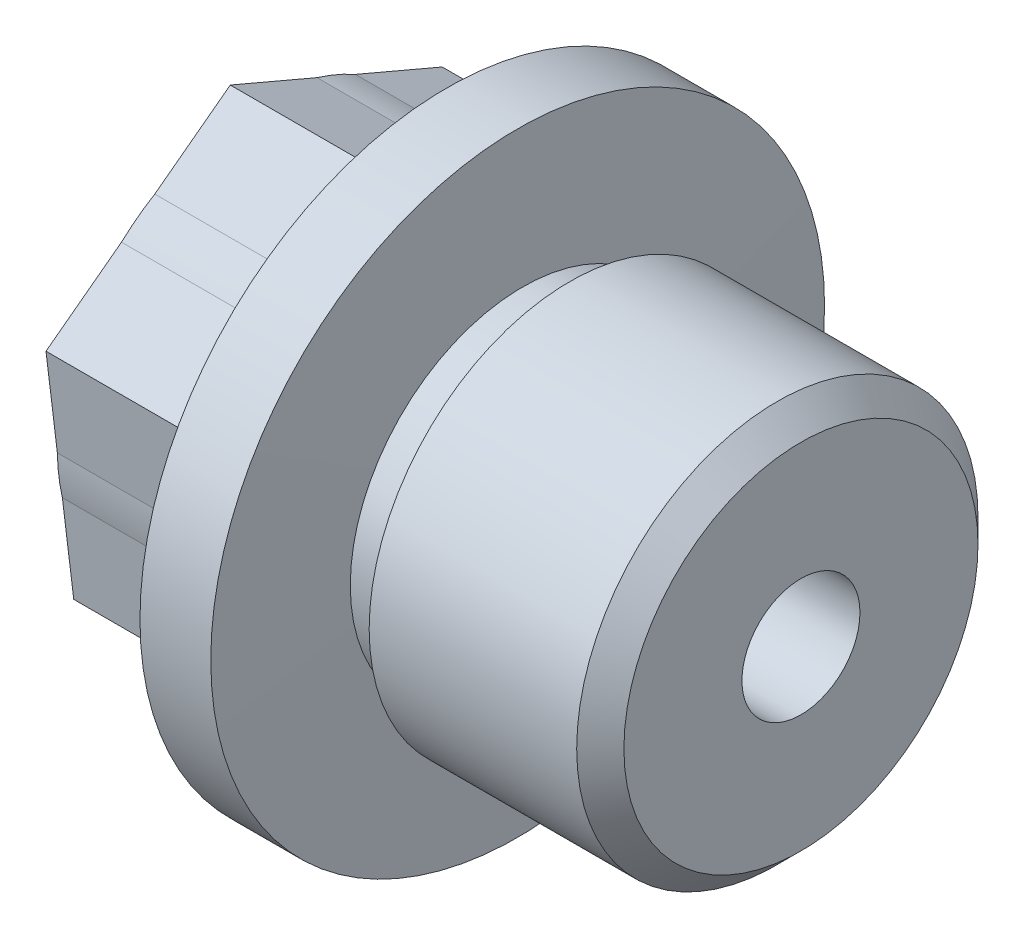
ISO-10303-21;
HEADER;
FILE_DESCRIPTION(('STEP AP214'),'2;1');
FILE_NAME('part.step','',(''),(''),'','','');
FILE_SCHEMA(('AUTOMOTIVE_DESIGN { 1 0 10303 214 1 1 1 1 }'));
ENDSEC;
DATA;
#1=APPLICATION_CONTEXT('core data for automotive mechanical design processes');
#2=APPLICATION_PROTOCOL_DEFINITION('international standard','automotive_design',2000,#1);
#3=PRODUCT_CONTEXT('',#1,'mechanical');
#4=PRODUCT('Part','Part','',(#3));
#5=PRODUCT_RELATED_PRODUCT_CATEGORY('part','',(#4));
#6=PRODUCT_DEFINITION_FORMATION('','',#4);
#7=PRODUCT_DEFINITION_CONTEXT('part definition',#1,'design');
#8=PRODUCT_DEFINITION('design','',#6,#7);
#9=PRODUCT_DEFINITION_SHAPE('','',#8);
#10=(LENGTH_UNIT() NAMED_UNIT(*) SI_UNIT(.MILLI.,.METRE.));
#11=(NAMED_UNIT(*) PLANE_ANGLE_UNIT() SI_UNIT($,.RADIAN.));
#12=(NAMED_UNIT(*) SI_UNIT($,.STERADIAN.) SOLID_ANGLE_UNIT());
#13=UNCERTAINTY_MEASURE_WITH_UNIT(LENGTH_MEASURE(1.E-05),#10,'distance_accuracy_value','');
#14=(GEOMETRIC_REPRESENTATION_CONTEXT(3) GLOBAL_UNCERTAINTY_ASSIGNED_CONTEXT((#13)) GLOBAL_UNIT_ASSIGNED_CONTEXT((#10,
#11,#12)) REPRESENTATION_CONTEXT('',''));
#15=CARTESIAN_POINT('',(0.,0.,0.));
#16=DIRECTION('',(0.,0.,1.));
#17=DIRECTION('',(1.,0.,0.));
#18=AXIS2_PLACEMENT_3D('',#15,#16,#17);
#19=CARTESIAN_POINT('',(0.,0.,0.));
#20=DIRECTION('',(-1.,0.,0.));
#21=DIRECTION('',(0.,0.,1.));
#22=AXIS2_PLACEMENT_3D('',#19,#20,#21);
#23=CYLINDRICAL_SURFACE('',#22,8.5);
#24=CARTESIAN_POINT('',(1.66092780110446,-7.28953517577543,-4.37180476704218));
#25=CARTESIAN_POINT('',(1.63707381874541,-7.2568538549321,-4.42630977240445));
#26=CARTESIAN_POINT('',(1.61577316542165,-7.22305693930965,-4.48126494638706));
#27=CARTESIAN_POINT('',(1.57841935837173,-7.15338904582183,-4.59165083804521));
#28=CARTESIAN_POINT('',(1.5623668003389,-7.11751783305356,-4.64708160897184));
#29=CARTESIAN_POINT('',(1.53564428720119,-7.04383503475077,-4.75802790459145));
#30=CARTESIAN_POINT('',(1.52497886387776,-7.00602184493767,-4.81354346136709));
#31=CARTESIAN_POINT('',(1.50913946756903,-6.92872124463507,-4.92416340552836));
#32=CARTESIAN_POINT('',(1.50396495810721,-6.88923399809735,-4.97926783255997));
#33=CARTESIAN_POINT('',(1.49676205230308,-6.76853394728055,-5.14347450088855));
#34=CARTESIAN_POINT('',(1.50306344386222,-6.68510814131137,-5.25143193780243));
#35=CARTESIAN_POINT('',(1.53770394602246,-6.51518647405897,-5.46081442433623));
#36=CARTESIAN_POINT('',(1.56599054233353,-6.42869839659352,-5.56225441738507));
#37=CARTESIAN_POINT('',(1.61309279549041,-6.32338265538053,-5.68028518993598));
#38=CARTESIAN_POINT('',(1.62198827177514,-6.30458956513437,-5.7011344926834));
#39=CARTESIAN_POINT('',(1.64073961049611,-6.26704049548611,-5.74238409351968));
#40=CARTESIAN_POINT('',(1.65059440371367,-6.24828449801058,-5.76278486112117));
#41=CARTESIAN_POINT('',(1.66092780110447,-6.22954656972502,-5.78297064972902));
#42=B_SPLINE_CURVE_WITH_KNOTS('',3,(#24,#25,#26,#27,#28,#29,#30,#31,#32,#33,#34,#35,#36,#37,#38,
#39,#40,#41),.UNSPECIFIED.,.F.,.F.,(4,2,2,2,2,2,2,2,4),(0.,0.203587103551452,0.407197307561788,
0.610978509075874,0.814739798805035,1.22240072825281,1.62909089219708,1.71741594544381,
1.8056436581319),.UNSPECIFIED.);
#43=CARTESIAN_POINT('',(1.66092780110446,-7.28953517577543,-4.37180476704217));
#44=VERTEX_POINT('',#43);
#45=CARTESIAN_POINT('',(1.66092780110447,-6.22954656972502,-5.78297064972902));
#46=VERTEX_POINT('',#45);
#47=EDGE_CURVE('E358',#44,#46,#42,.T.);
#48=ORIENTED_EDGE('',*,*,#47,.F.);
#49=DIRECTION('',(-1.,0.,0.));
#50=VECTOR('',#49,1.);
#51=CARTESIAN_POINT('',(0.,-7.28953517577543,-4.37180476704217));
#52=LINE('',#51,#50);
#53=CARTESIAN_POINT('',(0.,-7.28953517577543,-4.37180476704217));
#54=VERTEX_POINT('',#53);
#55=EDGE_CURVE('E295',#44,#54,#52,.T.);
#56=ORIENTED_EDGE('',*,*,#55,.T.);
#57=CARTESIAN_POINT('',(0.,0.,0.));
#58=DIRECTION('',(-1.,0.,0.));
#59=DIRECTION('',(0.,0.,1.));
#60=AXIS2_PLACEMENT_3D('',#57,#58,#59);
#61=CIRCLE('',#60,8.5);
#62=CARTESIAN_POINT('',(0.,-6.22954656972502,-5.78297064972902));
#63=VERTEX_POINT('',#62);
#64=EDGE_CURVE('E494',#63,#54,#61,.T.);
#65=ORIENTED_EDGE('',*,*,#64,.F.);
#66=DIRECTION('',(-1.,0.,0.));
#67=VECTOR('',#66,1.);
#68=CARTESIAN_POINT('',(0.,-6.22954656972502,-5.78297064972902));
#69=LINE('',#68,#67);
#70=EDGE_CURVE('E291',#63,#46,#69,.F.);
#71=ORIENTED_EDGE('',*,*,#70,.T.);
#72=EDGE_LOOP('',(#48,#56,#65,#71));
#73=FACE_BOUND('',#72,.T.);
#74=ADVANCED_FACE('F50',(#73),#23,.T.);
#75=CARTESIAN_POINT('',(6.33907219889553,-6.22954656972502,-5.78297064972902));
#76=CARTESIAN_POINT('',(6.36292618125459,-6.27278880295138,-5.73639840899269));
#77=CARTESIAN_POINT('',(6.38422683457835,-6.31615258304668,-5.68862932663919));
#78=CARTESIAN_POINT('',(6.42158064162827,-6.40275903641742,-5.59096673044833));
#79=CARTESIAN_POINT('',(6.43763319966109,-6.44600169539291,-5.5410729761727));
#80=CARTESIAN_POINT('',(6.46435571279881,-6.53202783367832,-5.43939830474888));
#81=CARTESIAN_POINT('',(6.47502113612224,-6.57481089685691,-5.38761583789949));
#82=CARTESIAN_POINT('',(6.49086053243097,-6.65951570323916,-5.28255751776666));
#83=CARTESIAN_POINT('',(6.49603504189279,-6.70143753019529,-5.22928181089878));
#84=CARTESIAN_POINT('',(6.50323794769692,-6.82551662847868,-5.06761329337006));
#85=CARTESIAN_POINT('',(6.49693655613778,-6.90595788876032,-4.9574140332504));
#86=CARTESIAN_POINT('',(6.46229605397754,-7.0597113459669,-4.73588689480922));
#87=CARTESIAN_POINT('',(6.43400945766647,-7.13304006322293,-4.62456232897129));
#88=CARTESIAN_POINT('',(6.38690720450959,-7.21705741888079,-4.49053340461365));
#89=CARTESIAN_POINT('',(6.37801172822487,-7.2318456121035,-4.46667584800653));
#90=CARTESIAN_POINT('',(6.35926038950389,-7.26100110945481,-4.4191214667699));
#91=CARTESIAN_POINT('',(6.34940559628633,-7.27536885947228,-4.39542449397868));
#92=CARTESIAN_POINT('',(6.33907219889554,-7.28953517577543,-4.37180476704218));
#93=B_SPLINE_CURVE_WITH_KNOTS('',3,(#75,#76,#77,#78,#79,#80,#81,#82,#83,#84,#85,#86,#87,#88,#89,
#90,#91,#92),.UNSPECIFIED.,.F.,.F.,(4,2,2,2,2,2,2,2,4),(0.,0.203587103551452,0.407197307561789,
0.610978509075874,0.814739798805037,1.22240072825281,1.62909089219708,1.71741594544381,
1.8056436581319),.UNSPECIFIED.);
#94=CARTESIAN_POINT('',(6.33907219889553,-6.22954656972502,-5.78297064972902));
#95=VERTEX_POINT('',#94);
#96=CARTESIAN_POINT('',(6.33907219889553,-7.28953517577543,-4.37180476704217));
#97=VERTEX_POINT('',#96);
#98=EDGE_CURVE('E65',#95,#97,#93,.T.);
#99=ORIENTED_EDGE('',*,*,#98,.F.);
#100=CARTESIAN_POINT('',(8.,-6.22954656972502,-5.78297064972902));
#101=VERTEX_POINT('',#100);
#102=EDGE_CURVE('E297',#95,#101,#69,.F.);
#103=ORIENTED_EDGE('',*,*,#102,.T.);
#104=CARTESIAN_POINT('',(8.,0.,0.));
#105=DIRECTION('',(-1.,0.,0.));
#106=DIRECTION('',(0.,0.,1.));
#107=AXIS2_PLACEMENT_3D('',#104,#105,#106);
#108=CIRCLE('',#107,8.5);
#109=CARTESIAN_POINT('',(8.,-7.28953517577543,-4.37180476704217));
#110=VERTEX_POINT('',#109);
#111=EDGE_CURVE('E472',#101,#110,#108,.T.);
#112=ORIENTED_EDGE('',*,*,#111,.T.);
#113=EDGE_CURVE('E288',#110,#97,#52,.T.);
#114=ORIENTED_EDGE('',*,*,#113,.T.);
#115=EDGE_LOOP('',(#99,#103,#112,#114));
#116=FACE_BOUND('',#115,.T.);
#117=ADVANCED_FACE('F384',(#116),#23,.T.);
#118=CARTESIAN_POINT('',(5.,0.,0.));
#119=DIRECTION('',(1.,0.,0.));
#120=DIRECTION('',(0.,0.,-1.));
#121=AXIS2_PLACEMENT_3D('',#118,#119,#120);
#122=CYLINDRICAL_SURFACE('',#121,2.5);
#123=CARTESIAN_POINT('',(23.,0.,0.));
#124=DIRECTION('',(1.,0.,0.));
#125=DIRECTION('',(0.,0.,-1.));
#126=AXIS2_PLACEMENT_3D('',#123,#124,#125);
#127=CIRCLE('',#126,2.5);
#128=CARTESIAN_POINT('',(23.,0.,-2.5));
#129=VERTEX_POINT('',#128);
#130=EDGE_CURVE('E354',#129,#129,#127,.T.);
#131=ORIENTED_EDGE('',*,*,#130,.T.);
#132=EDGE_LOOP('',(#131));
#133=FACE_BOUND('',#132,.T.);
#134=CARTESIAN_POINT('',(4.,0.,0.));
#135=DIRECTION('',(0.707106781186547,0.565374849456442,0.424677853910592));
#136=DIRECTION('',(0.707106781186547,-0.565374849456442,-0.424677853910592));
#137=AXIS2_PLACEMENT_3D('',#134,#135,#136);
#138=ELLIPSE('',#137,3.53553390593274,2.5);
#139=CARTESIAN_POINT('',(5.,-2.17567430570138,1.23143871772444));
#140=VERTEX_POINT('',#139);
#141=CARTESIAN_POINT('',(5.,0.576552745849493,-2.43260907900415));
#142=VERTEX_POINT('',#141);
#143=EDGE_CURVE('E204',#140,#142,#138,.T.);
#144=ORIENTED_EDGE('',*,*,#143,.F.);
#145=CARTESIAN_POINT('',(5.,0.,0.));
#146=DIRECTION('',(1.,0.,0.));
#147=DIRECTION('',(0.,0.,-1.));
#148=AXIS2_PLACEMENT_3D('',#145,#146,#147);
#149=CIRCLE('',#148,2.5);
#150=EDGE_CURVE('E207',#142,#140,#149,.T.);
#151=ORIENTED_EDGE('',*,*,#150,.F.);
#152=EDGE_LOOP('',(#144,#151));
#153=FACE_BOUND('',#152,.T.);
#154=ADVANCED_FACE('F385',(#133,#153),#122,.F.);
#155=CARTESIAN_POINT('',(5.,0.,0.));
#156=DIRECTION('',(1.,0.,0.));
#157=DIRECTION('',(0.,0.,-1.));
#158=AXIS2_PLACEMENT_3D('',#155,#156,#157);
#159=PLANE('',#158);
#160=DIRECTION('',(0.,0.600585180639859,-0.799560779925947));
#161=VECTOR('',#160,1.);
#162=CARTESIAN_POINT('',(5.,0.,0.));
#163=LINE('',#162,#161);
#164=CARTESIAN_POINT('',(5.,-1.37611352577544,1.83202389836429));
#165=VERTEX_POINT('',#164);
#166=CARTESIAN_POINT('',(5.,1.37611352577544,-1.83202389836429));
#167=VERTEX_POINT('',#166);
#168=EDGE_CURVE('E195',#165,#167,#163,.T.);
#169=ORIENTED_EDGE('',*,*,#168,.T.);
#170=DIRECTION('',(0.,0.799560779925947,0.600585180639859));
#171=VECTOR('',#170,1.);
#172=CARTESIAN_POINT('',(5.,-19.7755213856418,-17.7199448582673));
#173=LINE('',#172,#171);
#174=EDGE_CURVE('E11',#167,#142,#173,.F.);
#175=ORIENTED_EDGE('',*,*,#174,.T.);
#176=ORIENTED_EDGE('',*,*,#150,.T.);
#177=DIRECTION('',(0.,0.799560779925947,0.600585180639859));
#178=VECTOR('',#177,1.);
#179=CARTESIAN_POINT('',(5.,-22.5277484371927,-14.0558970615388));
#180=LINE('',#179,#178);
#181=EDGE_CURVE('E57',#140,#165,#180,.T.);
#182=ORIENTED_EDGE('',*,*,#181,.T.);
#183=EDGE_LOOP('',(#169,#175,#176,#182));
#184=FACE_BOUND('',#183,.T.);
#185=ADVANCED_FACE('F210',(#184),#159,.T.);
#186=CARTESIAN_POINT('',(8.,-8.12297277686764,2.50346025857557));
#187=VERTEX_POINT('',#186);
#188=CARTESIAN_POINT('',(8.,-7.43086157653215,4.1270202604807));
#189=VERTEX_POINT('',#188);
#190=EDGE_CURVE('E474',#187,#189,#108,.T.);
#191=ORIENTED_EDGE('',*,*,#190,.T.);
#192=DIRECTION('',(-1.,0.,0.));
#193=VECTOR('',#192,1.);
#194=CARTESIAN_POINT('',(0.,-7.43086157653215,4.12702026048069));
#195=LINE('',#194,#193);
#196=CARTESIAN_POINT('',(0.,-7.43086157653215,4.12702026048069));
#197=VERTEX_POINT('',#196);
#198=EDGE_CURVE('E259',#189,#197,#195,.T.);
#199=ORIENTED_EDGE('',*,*,#198,.T.);
#200=CARTESIAN_POINT('',(0.,-8.12297277686763,2.50346025857558));
#201=VERTEX_POINT('',#200);
#202=EDGE_CURVE('E492',#201,#197,#61,.T.);
#203=ORIENTED_EDGE('',*,*,#202,.F.);
#204=DIRECTION('',(-1.,0.,0.));
#205=VECTOR('',#204,1.);
#206=CARTESIAN_POINT('',(0.,-8.12297277686764,2.50346025857558));
#207=LINE('',#206,#205);
#208=EDGE_CURVE('E265',#201,#187,#207,.F.);
#209=ORIENTED_EDGE('',*,*,#208,.T.);
#210=EDGE_LOOP('',(#191,#199,#203,#209));
#211=FACE_BOUND('',#210,.T.);
#212=ADVANCED_FACE('F381',(#211),#23,.T.);
#213=CARTESIAN_POINT('',(8.,-1.89342620714259,8.28643090830459));
#214=VERTEX_POINT('',#213);
#215=CARTESIAN_POINT('',(8.,-0.141326400756745,8.49882502752287));
#216=VERTEX_POINT('',#215);
#217=EDGE_CURVE('E245',#214,#216,#108,.T.);
#218=ORIENTED_EDGE('',*,*,#217,.T.);
#219=DIRECTION('',(-1.,0.,0.));
#220=VECTOR('',#219,1.);
#221=CARTESIAN_POINT('',(0.,-0.14132640075673,8.49882502752287));
#222=LINE('',#221,#220);
#223=CARTESIAN_POINT('',(0.,-0.14132640075673,8.49882502752287));
#224=VERTEX_POINT('',#223);
#225=EDGE_CURVE('E264',#216,#224,#222,.T.);
#226=ORIENTED_EDGE('',*,*,#225,.T.);
#227=CARTESIAN_POINT('',(0.,-1.8934262071426,8.28643090830459));
#228=VERTEX_POINT('',#227);
#229=EDGE_CURVE('E236',#228,#224,#61,.T.);
#230=ORIENTED_EDGE('',*,*,#229,.F.);
#231=DIRECTION('',(-1.,0.,0.));
#232=VECTOR('',#231,1.);
#233=CARTESIAN_POINT('',(0.,-1.8934262071426,8.28643090830459));
#234=LINE('',#233,#232);
#235=EDGE_CURVE('E268',#228,#214,#234,.F.);
#236=ORIENTED_EDGE('',*,*,#235,.T.);
#237=EDGE_LOOP('',(#218,#226,#230,#236));
#238=FACE_BOUND('',#237,.T.);
#239=ADVANCED_FACE('F483',(#238),#23,.T.);
#240=CARTESIAN_POINT('',(8.,6.22954656972502,5.78297064972902));
#241=VERTEX_POINT('',#240);
#242=CARTESIAN_POINT('',(8.,7.28953517577543,4.37180476704217));
#243=VERTEX_POINT('',#242);
#244=EDGE_CURVE('E239',#241,#243,#108,.T.);
#245=ORIENTED_EDGE('',*,*,#244,.T.);
#246=DIRECTION('',(-1.,0.,0.));
#247=VECTOR('',#246,1.);
#248=CARTESIAN_POINT('',(0.,7.28953517577543,4.37180476704217));
#249=LINE('',#248,#247);
#250=CARTESIAN_POINT('',(0.,7.28953517577543,4.37180476704217));
#251=VERTEX_POINT('',#250);
#252=EDGE_CURVE('E271',#243,#251,#249,.T.);
#253=ORIENTED_EDGE('',*,*,#252,.T.);
#254=CARTESIAN_POINT('',(0.,6.22954656972502,5.78297064972902));
#255=VERTEX_POINT('',#254);
#256=EDGE_CURVE('E232',#255,#251,#61,.T.);
#257=ORIENTED_EDGE('',*,*,#256,.F.);
#258=DIRECTION('',(-1.,0.,0.));
#259=VECTOR('',#258,1.);
#260=CARTESIAN_POINT('',(0.,6.22954656972502,5.78297064972902));
#261=LINE('',#260,#259);
#262=EDGE_CURVE('E273',#255,#241,#261,.F.);
#263=ORIENTED_EDGE('',*,*,#262,.T.);
#264=EDGE_LOOP('',(#245,#253,#257,#263));
#265=FACE_BOUND('',#264,.T.);
#266=ADVANCED_FACE('F461',(#265),#23,.T.);
#267=CARTESIAN_POINT('',(8.,8.12297277686764,-2.50346025857558));
#268=VERTEX_POINT('',#267);
#269=CARTESIAN_POINT('',(8.,7.43086157653215,-4.12702026048069));
#270=VERTEX_POINT('',#269);
#271=EDGE_CURVE('E244',#268,#270,#108,.T.);
#272=ORIENTED_EDGE('',*,*,#271,.T.);
#273=DIRECTION('',(-1.,0.,0.));
#274=VECTOR('',#273,1.);
#275=CARTESIAN_POINT('',(0.,7.43086157653215,-4.12702026048069));
#276=LINE('',#275,#274);
#277=CARTESIAN_POINT('',(0.,7.43086157653215,-4.12702026048069));
#278=VERTEX_POINT('',#277);
#279=EDGE_CURVE('E280',#270,#278,#276,.T.);
#280=ORIENTED_EDGE('',*,*,#279,.T.);
#281=CARTESIAN_POINT('',(0.,8.12297277686764,-2.50346025857558));
#282=VERTEX_POINT('',#281);
#283=EDGE_CURVE('E240',#282,#278,#61,.T.);
#284=ORIENTED_EDGE('',*,*,#283,.F.);
#285=DIRECTION('',(-1.,0.,0.));
#286=VECTOR('',#285,1.);
#287=CARTESIAN_POINT('',(0.,8.12297277686764,-2.50346025857558));
#288=LINE('',#287,#286);
#289=EDGE_CURVE('E278',#282,#268,#288,.F.);
#290=ORIENTED_EDGE('',*,*,#289,.T.);
#291=EDGE_LOOP('',(#272,#280,#284,#290));
#292=FACE_BOUND('',#291,.T.);
#293=ADVANCED_FACE('F459',(#292),#23,.T.);
#294=CARTESIAN_POINT('',(8.,1.89342620714259,-8.28643090830459));
#295=VERTEX_POINT('',#294);
#296=CARTESIAN_POINT('',(8.,0.141326400756746,-8.49882502752287));
#297=VERTEX_POINT('',#296);
#298=EDGE_CURVE('E469',#295,#297,#108,.T.);
#299=ORIENTED_EDGE('',*,*,#298,.T.);
#300=DIRECTION('',(-1.,0.,0.));
#301=VECTOR('',#300,1.);
#302=CARTESIAN_POINT('',(0.,0.141326400756716,-8.49882502752287));
#303=LINE('',#302,#301);
#304=CARTESIAN_POINT('',(0.,0.141326400756716,-8.49882502752287));
#305=VERTEX_POINT('',#304);
#306=EDGE_CURVE('E285',#297,#305,#303,.T.);
#307=ORIENTED_EDGE('',*,*,#306,.T.);
#308=CARTESIAN_POINT('',(0.,1.89342620714262,-8.28643090830458));
#309=VERTEX_POINT('',#308);
#310=EDGE_CURVE('E500',#309,#305,#61,.T.);
#311=ORIENTED_EDGE('',*,*,#310,.F.);
#312=DIRECTION('',(-1.,0.,0.));
#313=VECTOR('',#312,1.);
#314=CARTESIAN_POINT('',(0.,1.89342620714262,-8.28643090830458));
#315=LINE('',#314,#313);
#316=EDGE_CURVE('E286',#309,#295,#315,.F.);
#317=ORIENTED_EDGE('',*,*,#316,.T.);
#318=EDGE_LOOP('',(#299,#307,#311,#317));
#319=FACE_BOUND('',#318,.T.);
#320=ADVANCED_FACE('F449',(#319),#23,.T.);
#321=CARTESIAN_POINT('',(0.,0.,0.));
#322=DIRECTION('',(1.,0.,0.));
#323=DIRECTION('',(0.,0.,-1.));
#324=AXIS2_PLACEMENT_3D('',#321,#322,#323);
#325=PLANE('',#324);
#326=ORIENTED_EDGE('',*,*,#64,.T.);
#327=DIRECTION('',(0.,-0.600585180639859,0.799560779925947));
#328=VECTOR('',#327,1.);
#329=CARTESIAN_POINT('',(0.,-6.75954087275023,-5.0773877083856));
#330=LINE('',#329,#328);
#331=CARTESIAN_POINT('',(0.,-9.69097203296675,-1.17476496590497));
#332=VERTEX_POINT('',#331);
#333=EDGE_CURVE('E334',#54,#332,#330,.T.);
#334=ORIENTED_EDGE('',*,*,#333,.T.);
#335=DIRECTION('',(0.,0.39214735696564,0.919902413533557));
#336=VECTOR('',#335,1.);
#337=CARTESIAN_POINT('',(0.,-7.77691717669989,3.31524025952813));
#338=LINE('',#337,#336);
#339=EDGE_CURVE('E331',#332,#201,#338,.T.);
#340=ORIENTED_EDGE('',*,*,#339,.T.);
#341=ORIENTED_EDGE('',*,*,#202,.T.);
#342=CARTESIAN_POINT('',(0.,-5.86286232043304,7.80524548496124));
#343=VERTEX_POINT('',#342);
#344=EDGE_CURVE('E335',#197,#343,#338,.T.);
#345=ORIENTED_EDGE('',*,*,#344,.T.);
#346=DIRECTION('',(0.,0.992732537605498,0.12034163360761));
#347=VECTOR('',#346,1.);
#348=CARTESIAN_POINT('',(0.,-1.01737630394967,8.39262796791373));
#349=LINE('',#348,#347);
#350=EDGE_CURVE('E340',#343,#228,#349,.T.);
#351=ORIENTED_EDGE('',*,*,#350,.T.);
#352=ORIENTED_EDGE('',*,*,#229,.T.);
#353=CARTESIAN_POINT('',(0.,3.82810971253371,8.98001045086622));
#354=VERTEX_POINT('',#353);
#355=EDGE_CURVE('E339',#224,#354,#349,.T.);
#356=ORIENTED_EDGE('',*,*,#355,.T.);
#357=DIRECTION('',(0.,0.600585180639859,-0.799560779925947));
#358=VECTOR('',#357,1.);
#359=CARTESIAN_POINT('',(0.,6.75954087275023,5.0773877083856));
#360=LINE('',#359,#358);
#361=EDGE_CURVE('E342',#354,#255,#360,.T.);
#362=ORIENTED_EDGE('',*,*,#361,.T.);
#363=ORIENTED_EDGE('',*,*,#256,.T.);
#364=CARTESIAN_POINT('',(0.,9.69097203296674,1.17476496590498));
#365=VERTEX_POINT('',#364);
#366=EDGE_CURVE('E341',#251,#365,#360,.T.);
#367=ORIENTED_EDGE('',*,*,#366,.T.);
#368=DIRECTION('',(0.,-0.39214735696564,-0.919902413533557));
#369=VECTOR('',#368,1.);
#370=CARTESIAN_POINT('',(0.,7.77691717669989,-3.31524025952813));
#371=LINE('',#370,#369);
#372=EDGE_CURVE('E347',#365,#282,#371,.T.);
#373=ORIENTED_EDGE('',*,*,#372,.T.);
#374=ORIENTED_EDGE('',*,*,#283,.T.);
#375=CARTESIAN_POINT('',(0.,5.86286232043304,-7.80524548496124));
#376=VERTEX_POINT('',#375);
#377=EDGE_CURVE('E345',#278,#376,#371,.T.);
#378=ORIENTED_EDGE('',*,*,#377,.T.);
#379=DIRECTION('',(0.,-0.992732537605498,-0.12034163360761));
#380=VECTOR('',#379,1.);
#381=CARTESIAN_POINT('',(0.,1.01737630394967,-8.39262796791373));
#382=LINE('',#381,#380);
#383=EDGE_CURVE('E327',#376,#309,#382,.T.);
#384=ORIENTED_EDGE('',*,*,#383,.T.);
#385=ORIENTED_EDGE('',*,*,#310,.T.);
#386=CARTESIAN_POINT('',(0.,-3.8281097125337,-8.98001045086622));
#387=VERTEX_POINT('',#386);
#388=EDGE_CURVE('E349',#305,#387,#382,.T.);
#389=ORIENTED_EDGE('',*,*,#388,.T.);
#390=EDGE_CURVE('E328',#387,#63,#330,.T.);
#391=ORIENTED_EDGE('',*,*,#390,.T.);
#392=EDGE_LOOP('',(#326,#334,#340,#341,#345,#351,#352,#356,#362,#363,#367,#373,#374,#378,#384,
#385,#389,#391));
#393=FACE_BOUND('',#392,.T.);
#394=ADVANCED_FACE('F445',(#393),#325,.F.);
#395=CARTESIAN_POINT('',(8.,8.5,0.));
#396=DIRECTION('',(1.,0.,0.));
#397=DIRECTION('',(0.,0.,-1.));
#398=AXIS2_PLACEMENT_3D('',#395,#396,#397);
#399=PLANE('',#398);
#400=DIRECTION('',(0.,0.992732537605498,0.12034163360761));
#401=VECTOR('',#400,1.);
#402=CARTESIAN_POINT('',(8.,-1.01737630394967,8.39262796791373));
#403=LINE('',#402,#401);
#404=CARTESIAN_POINT('',(8.,-5.86286232043304,7.80524548496124));
#405=VERTEX_POINT('',#404);
#406=EDGE_CURVE('E303',#405,#214,#403,.T.);
#407=ORIENTED_EDGE('',*,*,#406,.F.);
#408=DIRECTION('',(0.,-0.39214735696564,-0.919902413533557));
#409=VECTOR('',#408,1.);
#410=CARTESIAN_POINT('',(8.,-6.46979100531123,6.38150731066286));
#411=LINE('',#410,#409);
#412=EDGE_CURVE('E216',#405,#189,#411,.T.);
#413=ORIENTED_EDGE('',*,*,#412,.T.);
#414=ORIENTED_EDGE('',*,*,#190,.F.);
#415=DIRECTION('',(0.,0.39214735696564,0.919902413533557));
#416=VECTOR('',#415,1.);
#417=CARTESIAN_POINT('',(8.,-7.77691717669989,3.31524025952813));
#418=LINE('',#417,#416);
#419=CARTESIAN_POINT('',(8.,-9.69097203296675,-1.17476496590497));
#420=VERTEX_POINT('',#419);
#421=EDGE_CURVE('E305',#420,#187,#418,.T.);
#422=ORIENTED_EDGE('',*,*,#421,.F.);
#423=DIRECTION('',(0.,0.600585180639859,-0.799560779925947));
#424=VECTOR('',#423,1.);
#425=CARTESIAN_POINT('',(8.,-3.69356911951443,-9.15912472966275));
#426=LINE('',#425,#424);
#427=EDGE_CURVE('E227',#420,#110,#426,.T.);
#428=ORIENTED_EDGE('',*,*,#427,.T.);
#429=ORIENTED_EDGE('',*,*,#111,.F.);
#430=DIRECTION('',(0.,-0.600585180639859,0.799560779925947));
#431=VECTOR('',#430,1.);
#432=CARTESIAN_POINT('',(8.,-6.75954087275023,-5.0773877083856));
#433=LINE('',#432,#431);
#434=CARTESIAN_POINT('',(8.,-3.8281097125337,-8.98001045086622));
#435=VERTEX_POINT('',#434);
#436=EDGE_CURVE('E298',#435,#101,#433,.T.);
#437=ORIENTED_EDGE('',*,*,#436,.F.);
#438=DIRECTION('',(0.,0.992732537605498,0.12034163360761));
#439=VECTOR('',#438,1.);
#440=CARTESIAN_POINT('',(8.,9.39427837932521,-7.3771579977713));
#441=LINE('',#440,#439);
#442=EDGE_CURVE('E226',#435,#297,#441,.T.);
#443=ORIENTED_EDGE('',*,*,#442,.T.);
#444=ORIENTED_EDGE('',*,*,#298,.F.);
#445=DIRECTION('',(0.,-0.992732537605498,-0.12034163360761));
#446=VECTOR('',#445,1.);
#447=CARTESIAN_POINT('',(8.,1.01737630394967,-8.39262796791373));
#448=LINE('',#447,#446);
#449=CARTESIAN_POINT('',(8.,5.86286232043304,-7.80524548496124));
#450=VERTEX_POINT('',#449);
#451=EDGE_CURVE('E320',#450,#295,#448,.T.);
#452=ORIENTED_EDGE('',*,*,#451,.F.);
#453=DIRECTION('',(0.,0.39214735696564,0.919902413533557));
#454=VECTOR('',#453,1.);
#455=CARTESIAN_POINT('',(8.,9.08404334808856,-0.248973208393409));
#456=LINE('',#455,#454);
#457=EDGE_CURVE('E224',#450,#270,#456,.T.);
#458=ORIENTED_EDGE('',*,*,#457,.T.);
#459=ORIENTED_EDGE('',*,*,#271,.F.);
#460=DIRECTION('',(0.,-0.39214735696564,-0.919902413533557));
#461=VECTOR('',#460,1.);
#462=CARTESIAN_POINT('',(8.,7.77691717669989,-3.31524025952813));
#463=LINE('',#462,#461);
#464=CARTESIAN_POINT('',(8.,9.69097203296675,1.17476496590498));
#465=VERTEX_POINT('',#464);
#466=EDGE_CURVE('E311',#465,#268,#463,.T.);
#467=ORIENTED_EDGE('',*,*,#466,.F.);
#468=DIRECTION('',(0.,-0.600585180639859,0.799560779925947));
#469=VECTOR('',#468,1.);
#470=CARTESIAN_POINT('',(8.,9.82551262598603,0.995650687108441));
#471=LINE('',#470,#469);
#472=EDGE_CURVE('E219',#465,#243,#471,.T.);
#473=ORIENTED_EDGE('',*,*,#472,.T.);
#474=ORIENTED_EDGE('',*,*,#244,.F.);
#475=DIRECTION('',(0.,0.600585180639859,-0.799560779925947));
#476=VECTOR('',#475,1.);
#477=CARTESIAN_POINT('',(8.,6.75954087275023,5.0773877083856));
#478=LINE('',#477,#476);
#479=CARTESIAN_POINT('',(8.,3.8281097125337,8.98001045086622));
#480=VERTEX_POINT('',#479);
#481=EDGE_CURVE('E310',#480,#241,#478,.T.);
#482=ORIENTED_EDGE('',*,*,#481,.F.);
#483=DIRECTION('',(0.,-0.992732537605498,-0.12034163360761));
#484=VECTOR('',#483,1.);
#485=CARTESIAN_POINT('',(8.,7.35952577142587,9.40809793805616));
#486=LINE('',#485,#484);
#487=EDGE_CURVE('E220',#480,#216,#486,.T.);
#488=ORIENTED_EDGE('',*,*,#487,.T.);
#489=ORIENTED_EDGE('',*,*,#217,.F.);
#490=EDGE_LOOP('',(#407,#413,#414,#422,#428,#429,#437,#443,#444,#452,#458,#459,#467,#473,#474,
#482,#488,#489));
#491=FACE_BOUND('',#490,.T.);
#492=CARTESIAN_POINT('',(8.,0.,0.));
#493=DIRECTION('',(-1.,0.,0.));
#494=DIRECTION('',(0.,0.,1.));
#495=AXIS2_PLACEMENT_3D('',#492,#493,#494);
#496=CIRCLE('',#495,13.);
#497=CARTESIAN_POINT('',(8.,0.,13.));
#498=VERTEX_POINT('',#497);
#499=EDGE_CURVE('E241',#498,#498,#496,.T.);
#500=ORIENTED_EDGE('',*,*,#499,.T.);
#501=EDGE_LOOP('',(#500));
#502=FACE_BOUND('',#501,.T.);
#503=ADVANCED_FACE('F438',(#491,#502),#399,.F.);
#504=CARTESIAN_POINT('',(0.,0.,0.));
#505=DIRECTION('',(-1.,0.,0.));
#506=DIRECTION('',(0.,0.,1.));
#507=AXIS2_PLACEMENT_3D('',#504,#505,#506);
#508=CYLINDRICAL_SURFACE('',#507,13.);
#509=ORIENTED_EDGE('',*,*,#499,.F.);
#510=EDGE_LOOP('',(#509));
#511=FACE_BOUND('',#510,.T.);
#512=CARTESIAN_POINT('',(11.,0.,0.));
#513=DIRECTION('',(-1.,0.,0.));
#514=DIRECTION('',(0.,0.,1.));
#515=AXIS2_PLACEMENT_3D('',#512,#513,#514);
#516=CIRCLE('',#515,13.);
#517=CARTESIAN_POINT('',(11.,0.,13.));
#518=VERTEX_POINT('',#517);
#519=EDGE_CURVE('E247',#518,#518,#516,.T.);
#520=ORIENTED_EDGE('',*,*,#519,.T.);
#521=EDGE_LOOP('',(#520));
#522=FACE_BOUND('',#521,.T.);
#523=ADVANCED_FACE('F436',(#511,#522),#508,.T.);
#524=CARTESIAN_POINT('',(11.2092653547601,0.,0.));
#525=DIRECTION('',(-1.,0.,0.));
#526=DIRECTION('',(0.,0.,1.));
#527=AXIS2_PLACEMENT_3D('',#524,#525,#526);
#528=CONICAL_SURFACE('',#527,7.3,1.5340995881016);
#529=ORIENTED_EDGE('',*,*,#519,.F.);
#530=EDGE_LOOP('',(#529));
#531=FACE_BOUND('',#530,.T.);
#532=CARTESIAN_POINT('',(11.2092653547601,0.,0.));
#533=DIRECTION('',(-1.,0.,0.));
#534=DIRECTION('',(0.,0.,1.));
#535=AXIS2_PLACEMENT_3D('',#532,#533,#534);
#536=CIRCLE('',#535,7.3);
#537=CARTESIAN_POINT('',(11.2092653547601,0.,7.3));
#538=VERTEX_POINT('',#537);
#539=EDGE_CURVE('E250',#538,#538,#536,.T.);
#540=ORIENTED_EDGE('',*,*,#539,.T.);
#541=EDGE_LOOP('',(#540));
#542=FACE_BOUND('',#541,.T.);
#543=ADVANCED_FACE('F435',(#531,#542),#528,.T.);
#544=CARTESIAN_POINT('',(0.,0.,0.));
#545=DIRECTION('',(-1.,0.,0.));
#546=DIRECTION('',(0.,0.,1.));
#547=AXIS2_PLACEMENT_3D('',#544,#545,#546);
#548=CYLINDRICAL_SURFACE('',#547,7.3);
#549=ORIENTED_EDGE('',*,*,#539,.F.);
#550=EDGE_LOOP('',(#549));
#551=FACE_BOUND('',#550,.T.);
#552=CARTESIAN_POINT('',(13.2092653547601,0.,0.));
#553=DIRECTION('',(-1.,0.,0.));
#554=DIRECTION('',(0.,0.,1.));
#555=AXIS2_PLACEMENT_3D('',#552,#553,#554);
#556=CIRCLE('',#555,7.3);
#557=CARTESIAN_POINT('',(13.2092653547601,0.,7.3));
#558=VERTEX_POINT('',#557);
#559=EDGE_CURVE('E251',#558,#558,#556,.T.);
#560=ORIENTED_EDGE('',*,*,#559,.T.);
#561=EDGE_LOOP('',(#560));
#562=FACE_BOUND('',#561,.T.);
#563=ADVANCED_FACE('F428',(#551,#562),#548,.T.);
#564=CARTESIAN_POINT('',(13.2092653547601,7.3,0.));
#565=DIRECTION('',(1.,0.,0.));
#566=DIRECTION('',(0.,0.,-1.));
#567=AXIS2_PLACEMENT_3D('',#564,#565,#566);
#568=PLANE('',#567);
#569=ORIENTED_EDGE('',*,*,#559,.F.);
#570=EDGE_LOOP('',(#569));
#571=FACE_BOUND('',#570,.T.);
#572=CARTESIAN_POINT('',(13.2092653547601,0.,0.));
#573=DIRECTION('',(-1.,0.,0.));
#574=DIRECTION('',(0.,0.,1.));
#575=AXIS2_PLACEMENT_3D('',#572,#573,#574);
#576=CIRCLE('',#575,8.5);
#577=CARTESIAN_POINT('',(13.2092653547601,0.,8.5));
#578=VERTEX_POINT('',#577);
#579=EDGE_CURVE('E258',#578,#578,#576,.T.);
#580=ORIENTED_EDGE('',*,*,#579,.T.);
#581=EDGE_LOOP('',(#580));
#582=FACE_BOUND('',#581,.T.);
#583=ADVANCED_FACE('F424',(#571,#582),#568,.F.);
#584=CARTESIAN_POINT('',(0.,0.,0.));
#585=DIRECTION('',(-1.,0.,0.));
#586=DIRECTION('',(0.,0.,1.));
#587=AXIS2_PLACEMENT_3D('',#584,#585,#586);
#588=CYLINDRICAL_SURFACE('',#587,8.5);
#589=CARTESIAN_POINT('',(22.,0.,0.));
#590=DIRECTION('',(-1.,0.,0.));
#591=DIRECTION('',(0.,0.,1.));
#592=AXIS2_PLACEMENT_3D('',#589,#590,#591);
#593=CIRCLE('',#592,8.5);
#594=CARTESIAN_POINT('',(22.,0.,8.5));
#595=VERTEX_POINT('',#594);
#596=EDGE_CURVE('E213',#595,#595,#593,.T.);
#597=ORIENTED_EDGE('',*,*,#596,.T.);
#598=EDGE_LOOP('',(#597));
#599=FACE_BOUND('',#598,.T.);
#600=ORIENTED_EDGE('',*,*,#579,.F.);
#601=EDGE_LOOP('',(#600));
#602=FACE_BOUND('',#601,.T.);
#603=ADVANCED_FACE('F419',(#599,#602),#588,.T.);
#604=CARTESIAN_POINT('',(23.,8.5,0.));
#605=DIRECTION('',(-1.,0.,0.));
#606=DIRECTION('',(0.,0.,1.));
#607=AXIS2_PLACEMENT_3D('',#604,#605,#606);
#608=PLANE('',#607);
#609=ORIENTED_EDGE('',*,*,#130,.F.);
#610=EDGE_LOOP('',(#609));
#611=FACE_BOUND('',#610,.T.);
#612=CARTESIAN_POINT('',(23.,0.,0.));
#613=DIRECTION('',(-1.,0.,0.));
#614=DIRECTION('',(0.,0.,1.));
#615=AXIS2_PLACEMENT_3D('',#612,#613,#614);
#616=CIRCLE('',#615,7.50000000000001);
#617=CARTESIAN_POINT('',(23.,0.,7.50000000000001));
#618=VERTEX_POINT('',#617);
#619=EDGE_CURVE('E200',#618,#618,#616,.F.);
#620=ORIENTED_EDGE('',*,*,#619,.T.);
#621=EDGE_LOOP('',(#620));
#622=FACE_BOUND('',#621,.T.);
#623=ADVANCED_FACE('F417',(#611,#622),#608,.F.);
#624=CARTESIAN_POINT('',(34.4238927216571,-6.75954087275023,-5.0773877083856));
#625=DIRECTION('',(0.,-0.799560779925947,-0.600585180639859));
#626=DIRECTION('',(0.,0.600585180639859,-0.799560779925947));
#627=AXIS2_PLACEMENT_3D('',#624,#625,#626);
#628=PLANE('',#627);
#629=ORIENTED_EDGE('',*,*,#102,.F.);
#630=CARTESIAN_POINT('',(4.,-6.75954087275023,-5.07738770838559));
#631=DIRECTION('',(0.,-0.799560779925947,-0.600585180639859));
#632=DIRECTION('',(0.,0.600585180639859,-0.799560779925947));
#633=AXIS2_PLACEMENT_3D('',#630,#631,#632);
#634=CIRCLE('',#633,2.5);
#635=EDGE_CURVE('E353',#95,#46,#634,.F.);
#636=ORIENTED_EDGE('',*,*,#635,.T.);
#637=ORIENTED_EDGE('',*,*,#70,.F.);
#638=ORIENTED_EDGE('',*,*,#390,.F.);
#639=DIRECTION('',(-1.,0.,0.));
#640=VECTOR('',#639,1.);
#641=CARTESIAN_POINT('',(34.4238927216571,-3.8281097125337,-8.98001045086622));
#642=LINE('',#641,#640);
#643=EDGE_CURVE('E318',#435,#387,#642,.T.);
#644=ORIENTED_EDGE('',*,*,#643,.F.);
#645=ORIENTED_EDGE('',*,*,#436,.T.);
#646=EDGE_LOOP('',(#629,#636,#637,#638,#644,#645));
#647=FACE_BOUND('',#646,.T.);
#648=ADVANCED_FACE('F395',(#647),#628,.T.);
#649=CARTESIAN_POINT('',(34.4238927216571,1.01737630394967,-8.39262796791373));
#650=DIRECTION('',(0.,0.12034163360761,-0.992732537605498));
#651=DIRECTION('',(0.,0.992732537605498,0.12034163360761));
#652=AXIS2_PLACEMENT_3D('',#649,#650,#651);
#653=PLANE('',#652);
#654=ORIENTED_EDGE('',*,*,#306,.F.);
#655=ORIENTED_EDGE('',*,*,#442,.F.);
#656=ORIENTED_EDGE('',*,*,#643,.T.);
#657=ORIENTED_EDGE('',*,*,#388,.F.);
#658=EDGE_LOOP('',(#654,#655,#656,#657));
#659=FACE_BOUND('',#658,.T.);
#660=ADVANCED_FACE('F392',(#659),#653,.T.);
#661=ORIENTED_EDGE('',*,*,#55,.F.);
#662=CARTESIAN_POINT('',(4.,-6.75954087275023,-5.07738770838559));
#663=DIRECTION('',(0.,-0.799560779925947,-0.600585180639859));
#664=DIRECTION('',(0.,0.600585180639859,-0.799560779925947));
#665=AXIS2_PLACEMENT_3D('',#662,#663,#664);
#666=CIRCLE('',#665,2.5);
#667=EDGE_CURVE('E521',#44,#97,#666,.F.);
#668=ORIENTED_EDGE('',*,*,#667,.T.);
#669=ORIENTED_EDGE('',*,*,#113,.F.);
#670=ORIENTED_EDGE('',*,*,#427,.F.);
#671=DIRECTION('',(-1.,0.,0.));
#672=VECTOR('',#671,1.);
#673=CARTESIAN_POINT('',(34.4238927216571,-9.69097203296675,-1.17476496590497));
#674=LINE('',#673,#672);
#675=EDGE_CURVE('E299',#420,#332,#674,.T.);
#676=ORIENTED_EDGE('',*,*,#675,.T.);
#677=ORIENTED_EDGE('',*,*,#333,.F.);
#678=EDGE_LOOP('',(#661,#668,#669,#670,#676,#677));
#679=FACE_BOUND('',#678,.T.);
#680=ADVANCED_FACE('F390',(#679),#628,.T.);
#681=CARTESIAN_POINT('',(34.4238927216571,-7.77691717669989,3.31524025952813));
#682=DIRECTION('',(0.,-0.919902413533557,0.39214735696564));
#683=DIRECTION('',(0.,-0.39214735696564,-0.919902413533557));
#684=AXIS2_PLACEMENT_3D('',#681,#682,#683);
#685=PLANE('',#684);
#686=ORIENTED_EDGE('',*,*,#208,.F.);
#687=ORIENTED_EDGE('',*,*,#339,.F.);
#688=ORIENTED_EDGE('',*,*,#675,.F.);
#689=ORIENTED_EDGE('',*,*,#421,.T.);
#690=EDGE_LOOP('',(#686,#687,#688,#689));
#691=FACE_BOUND('',#690,.T.);
#692=ADVANCED_FACE('F388',(#691),#685,.T.);
#693=ORIENTED_EDGE('',*,*,#316,.F.);
#694=ORIENTED_EDGE('',*,*,#383,.F.);
#695=DIRECTION('',(-1.,0.,0.));
#696=VECTOR('',#695,1.);
#697=CARTESIAN_POINT('',(34.4238927216571,5.86286232043304,-7.80524548496124));
#698=LINE('',#697,#696);
#699=EDGE_CURVE('E314',#450,#376,#698,.T.);
#700=ORIENTED_EDGE('',*,*,#699,.F.);
#701=ORIENTED_EDGE('',*,*,#451,.T.);
#702=EDGE_LOOP('',(#693,#694,#700,#701));
#703=FACE_BOUND('',#702,.T.);
#704=ADVANCED_FACE('F397',(#703),#653,.T.);
#705=CARTESIAN_POINT('',(34.4238927216571,7.77691717669989,-3.31524025952813));
#706=DIRECTION('',(0.,0.919902413533557,-0.39214735696564));
#707=DIRECTION('',(0.,0.39214735696564,0.919902413533557));
#708=AXIS2_PLACEMENT_3D('',#705,#706,#707);
#709=PLANE('',#708);
#710=ORIENTED_EDGE('',*,*,#279,.F.);
#711=ORIENTED_EDGE('',*,*,#457,.F.);
#712=ORIENTED_EDGE('',*,*,#699,.T.);
#713=ORIENTED_EDGE('',*,*,#377,.F.);
#714=EDGE_LOOP('',(#710,#711,#712,#713));
#715=FACE_BOUND('',#714,.T.);
#716=ADVANCED_FACE('F399',(#715),#709,.T.);
#717=ORIENTED_EDGE('',*,*,#289,.F.);
#718=ORIENTED_EDGE('',*,*,#372,.F.);
#719=DIRECTION('',(-1.,0.,0.));
#720=VECTOR('',#719,1.);
#721=CARTESIAN_POINT('',(34.4238927216571,9.69097203296674,1.17476496590498));
#722=LINE('',#721,#720);
#723=EDGE_CURVE('E309',#465,#365,#722,.T.);
#724=ORIENTED_EDGE('',*,*,#723,.F.);
#725=ORIENTED_EDGE('',*,*,#466,.T.);
#726=EDGE_LOOP('',(#717,#718,#724,#725));
#727=FACE_BOUND('',#726,.T.);
#728=ADVANCED_FACE('F402',(#727),#709,.T.);
#729=CARTESIAN_POINT('',(34.4238927216571,6.75954087275023,5.0773877083856));
#730=DIRECTION('',(0.,0.799560779925947,0.600585180639859));
#731=DIRECTION('',(0.,-0.600585180639859,0.799560779925947));
#732=AXIS2_PLACEMENT_3D('',#729,#730,#731);
#733=PLANE('',#732);
#734=ORIENTED_EDGE('',*,*,#252,.F.);
#735=ORIENTED_EDGE('',*,*,#472,.F.);
#736=ORIENTED_EDGE('',*,*,#723,.T.);
#737=ORIENTED_EDGE('',*,*,#366,.F.);
#738=EDGE_LOOP('',(#734,#735,#736,#737));
#739=FACE_BOUND('',#738,.T.);
#740=ADVANCED_FACE('F401',(#739),#733,.T.);
#741=ORIENTED_EDGE('',*,*,#262,.F.);
#742=ORIENTED_EDGE('',*,*,#361,.F.);
#743=DIRECTION('',(-1.,0.,0.));
#744=VECTOR('',#743,1.);
#745=CARTESIAN_POINT('',(34.4238927216571,3.82810971253371,8.98001045086622));
#746=LINE('',#745,#744);
#747=EDGE_CURVE('E308',#480,#354,#746,.T.);
#748=ORIENTED_EDGE('',*,*,#747,.F.);
#749=ORIENTED_EDGE('',*,*,#481,.T.);
#750=EDGE_LOOP('',(#741,#742,#748,#749));
#751=FACE_BOUND('',#750,.T.);
#752=ADVANCED_FACE('F407',(#751),#733,.T.);
#753=CARTESIAN_POINT('',(34.4238927216571,-1.01737630394967,8.39262796791373));
#754=DIRECTION('',(0.,-0.12034163360761,0.992732537605498));
#755=DIRECTION('',(0.,-0.992732537605498,-0.12034163360761));
#756=AXIS2_PLACEMENT_3D('',#753,#754,#755);
#757=PLANE('',#756);
#758=ORIENTED_EDGE('',*,*,#225,.F.);
#759=ORIENTED_EDGE('',*,*,#487,.F.);
#760=ORIENTED_EDGE('',*,*,#747,.T.);
#761=ORIENTED_EDGE('',*,*,#355,.F.);
#762=EDGE_LOOP('',(#758,#759,#760,#761));
#763=FACE_BOUND('',#762,.T.);
#764=ADVANCED_FACE('F410',(#763),#757,.T.);
#765=ORIENTED_EDGE('',*,*,#198,.F.);
#766=ORIENTED_EDGE('',*,*,#412,.F.);
#767=DIRECTION('',(-1.,0.,0.));
#768=VECTOR('',#767,1.);
#769=CARTESIAN_POINT('',(34.4238927216571,-5.86286232043304,7.80524548496124));
#770=LINE('',#769,#768);
#771=EDGE_CURVE('E301',#405,#343,#770,.T.);
#772=ORIENTED_EDGE('',*,*,#771,.T.);
#773=ORIENTED_EDGE('',*,*,#344,.F.);
#774=EDGE_LOOP('',(#765,#766,#772,#773));
#775=FACE_BOUND('',#774,.T.);
#776=ADVANCED_FACE('F411',(#775),#685,.T.);
#777=ORIENTED_EDGE('',*,*,#235,.F.);
#778=ORIENTED_EDGE('',*,*,#350,.F.);
#779=ORIENTED_EDGE('',*,*,#771,.F.);
#780=ORIENTED_EDGE('',*,*,#406,.T.);
#781=EDGE_LOOP('',(#777,#778,#779,#780));
#782=FACE_BOUND('',#781,.T.);
#783=ADVANCED_FACE('F414',(#782),#757,.T.);
#784=CARTESIAN_POINT('',(22.,0.,0.));
#785=DIRECTION('',(-1.,0.,0.));
#786=DIRECTION('',(0.,0.,1.));
#787=AXIS2_PLACEMENT_3D('',#784,#785,#786);
#788=CONICAL_SURFACE('',#787,8.5,0.785398163397452);
#789=ORIENTED_EDGE('',*,*,#619,.F.);
#790=EDGE_LOOP('',(#789));
#791=FACE_BOUND('',#790,.T.);
#792=ORIENTED_EDGE('',*,*,#596,.F.);
#793=EDGE_LOOP('',(#792));
#794=FACE_BOUND('',#793,.T.);
#795=ADVANCED_FACE('F49',(#791,#794),#788,.T.);
#796=CARTESIAN_POINT('',(4.,-21.1516349114173,-15.8879209599031));
#797=DIRECTION('',(0.,0.799560779925947,0.600585180639859));
#798=DIRECTION('',(0.,-0.600585180639859,0.799560779925947));
#799=AXIS2_PLACEMENT_3D('',#796,#797,#798);
#800=CYLINDRICAL_SURFACE('',#799,2.5);
#801=ORIENTED_EDGE('',*,*,#98,.T.);
#802=ORIENTED_EDGE('',*,*,#667,.F.);
#803=ORIENTED_EDGE('',*,*,#47,.T.);
#804=ORIENTED_EDGE('',*,*,#635,.F.);
#805=EDGE_LOOP('',(#801,#802,#803,#804));
#806=FACE_BOUND('',#805,.T.);
#807=CARTESIAN_POINT('',(4.,0.,0.));
#808=DIRECTION('',(0.,-0.799560779925947,-0.600585180639859));
#809=DIRECTION('',(0.,0.600585180639859,-0.799560779925947));
#810=AXIS2_PLACEMENT_3D('',#807,#808,#809);
#811=CIRCLE('',#810,2.5);
#812=EDGE_CURVE('E70',#165,#167,#811,.T.);
#813=ORIENTED_EDGE('',*,*,#812,.F.);
#814=ORIENTED_EDGE('',*,*,#181,.F.);
#815=ORIENTED_EDGE('',*,*,#143,.T.);
#816=ORIENTED_EDGE('',*,*,#174,.F.);
#817=EDGE_LOOP('',(#813,#814,#815,#816));
#818=FACE_BOUND('',#817,.T.);
#819=ADVANCED_FACE('F205',(#806,#818),#800,.F.);
#820=CARTESIAN_POINT('',(4.,0.,0.));
#821=DIRECTION('',(0.,-0.799560779925947,-0.600585180639859));
#822=DIRECTION('',(0.,0.600585180639859,-0.799560779925947));
#823=AXIS2_PLACEMENT_3D('',#820,#821,#822);
#824=PLANE('',#823);
#825=ORIENTED_EDGE('',*,*,#812,.T.);
#826=ORIENTED_EDGE('',*,*,#168,.F.);
#827=EDGE_LOOP('',(#825,#826));
#828=FACE_BOUND('',#827,.T.);
#829=ADVANCED_FACE('F198',(#828),#824,.T.);
#830=CLOSED_SHELL('',(#74,#117,#154,#185,#212,#239,#266,#293,#320,#394,#503,#523,#543,#563,#583,
#603,#623,#648,#660,#680,#692,#704,#716,#728,#740,#752,#764,#776,#783,#795,#819,#829));
#831=MANIFOLD_SOLID_BREP('B2',#830);
#832=ADVANCED_BREP_SHAPE_REPRESENTATION('',(#18,#831),#14);
#833=SHAPE_DEFINITION_REPRESENTATION(#9,#832);
ENDSEC;
END-ISO-10303-21;
